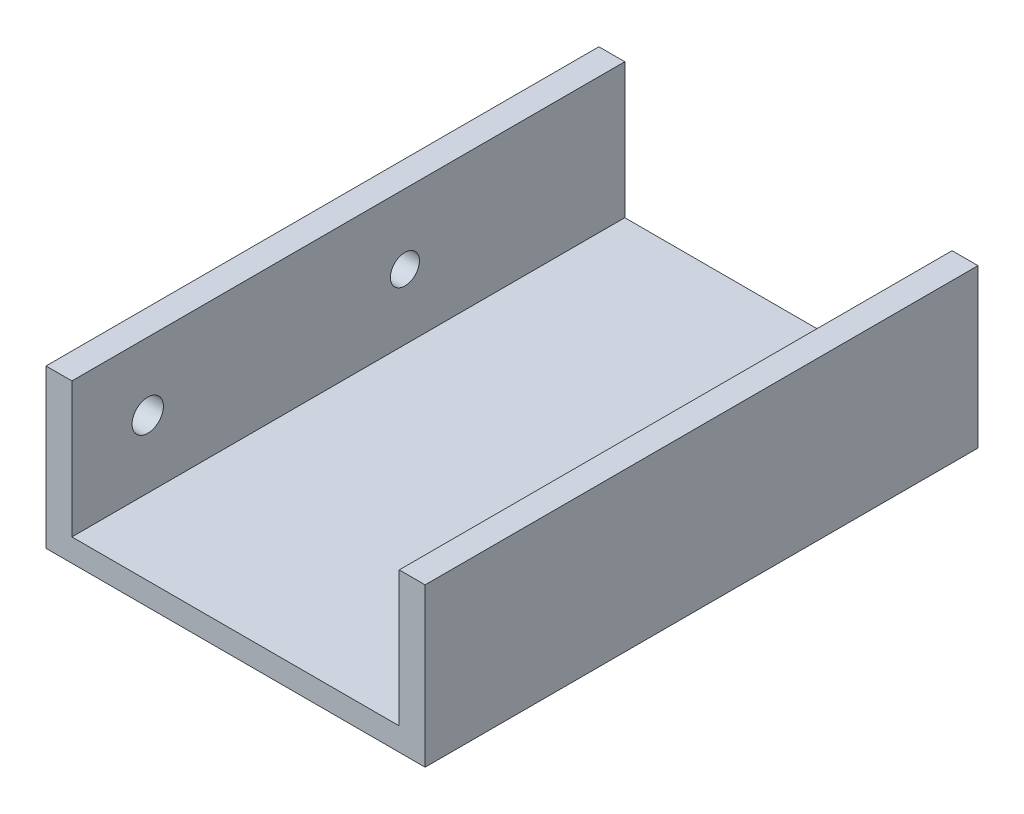
ISO-10303-21;
HEADER;
FILE_DESCRIPTION(('STEP AP214'),'2;1');
FILE_NAME('part.step','',(''),(''),'','','');
FILE_SCHEMA(('AUTOMOTIVE_DESIGN { 1 0 10303 214 1 1 1 1 }'));
ENDSEC;
DATA;
#1=APPLICATION_CONTEXT('core data for automotive mechanical design processes');
#2=APPLICATION_PROTOCOL_DEFINITION('international standard','automotive_design',2000,#1);
#3=PRODUCT_CONTEXT('',#1,'mechanical');
#4=PRODUCT('Part','Part','',(#3));
#5=PRODUCT_RELATED_PRODUCT_CATEGORY('part','',(#4));
#6=PRODUCT_DEFINITION_FORMATION('','',#4);
#7=PRODUCT_DEFINITION_CONTEXT('part definition',#1,'design');
#8=PRODUCT_DEFINITION('design','',#6,#7);
#9=PRODUCT_DEFINITION_SHAPE('','',#8);
#10=(LENGTH_UNIT() NAMED_UNIT(*) SI_UNIT(.MILLI.,.METRE.));
#11=(NAMED_UNIT(*) PLANE_ANGLE_UNIT() SI_UNIT($,.RADIAN.));
#12=(NAMED_UNIT(*) SI_UNIT($,.STERADIAN.) SOLID_ANGLE_UNIT());
#13=UNCERTAINTY_MEASURE_WITH_UNIT(LENGTH_MEASURE(1.E-05),#10,'distance_accuracy_value','');
#14=(GEOMETRIC_REPRESENTATION_CONTEXT(3) GLOBAL_UNCERTAINTY_ASSIGNED_CONTEXT((#13)) GLOBAL_UNIT_ASSIGNED_CONTEXT((#10,
#11,#12)) REPRESENTATION_CONTEXT('',''));
#15=CARTESIAN_POINT('',(0.,0.,0.));
#16=DIRECTION('',(0.,0.,1.));
#17=DIRECTION('',(1.,0.,0.));
#18=AXIS2_PLACEMENT_3D('',#15,#16,#17);
#19=CARTESIAN_POINT('',(-38.1,0.,111.125));
#20=DIRECTION('',(1.,0.,0.));
#21=DIRECTION('',(0.,0.,-1.));
#22=AXIS2_PLACEMENT_3D('',#19,#20,#21);
#23=PLANE('',#22);
#24=CARTESIAN_POINT('',(-38.1,18.1633908346726,95.885));
#25=DIRECTION('',(1.,0.,0.));
#26=DIRECTION('',(0.,0.,-1.));
#27=AXIS2_PLACEMENT_3D('',#24,#25,#26);
#28=CIRCLE('',#27,3.14546367246749);
#29=CARTESIAN_POINT('',(-38.1,18.1633908346726,92.7395363275325));
#30=VERTEX_POINT('',#29);
#31=EDGE_CURVE('E180',#30,#30,#28,.T.);
#32=ORIENTED_EDGE('',*,*,#31,.T.);
#33=EDGE_LOOP('',(#32));
#34=FACE_BOUND('',#33,.T.);
#35=CARTESIAN_POINT('',(-38.1,17.7352117874534,44.196));
#36=DIRECTION('',(1.,0.,0.));
#37=DIRECTION('',(0.,0.,-1.));
#38=AXIS2_PLACEMENT_3D('',#35,#36,#37);
#39=CIRCLE('',#38,2.921);
#40=CARTESIAN_POINT('',(-38.1,17.7352117874534,41.275));
#41=VERTEX_POINT('',#40);
#42=EDGE_CURVE('E133',#41,#41,#39,.T.);
#43=ORIENTED_EDGE('',*,*,#42,.T.);
#44=EDGE_LOOP('',(#43));
#45=FACE_BOUND('',#44,.T.);
#46=DIRECTION('',(0.,-1.,0.));
#47=VECTOR('',#46,1.);
#48=CARTESIAN_POINT('',(-38.1,0.,0.));
#49=LINE('',#48,#47);
#50=CARTESIAN_POINT('',(-38.1,31.75,0.));
#51=VERTEX_POINT('',#50);
#52=CARTESIAN_POINT('',(-38.1,0.,0.));
#53=VERTEX_POINT('',#52);
#54=EDGE_CURVE('E129',#51,#53,#49,.T.);
#55=ORIENTED_EDGE('',*,*,#54,.T.);
#56=DIRECTION('',(0.,0.,-1.));
#57=VECTOR('',#56,1.);
#58=CARTESIAN_POINT('',(-38.1,0.,111.125));
#59=LINE('',#58,#57);
#60=CARTESIAN_POINT('',(-38.1,0.,111.125));
#61=VERTEX_POINT('',#60);
#62=EDGE_CURVE('E11',#61,#53,#59,.T.);
#63=ORIENTED_EDGE('',*,*,#62,.F.);
#64=DIRECTION('',(0.,-1.,0.));
#65=VECTOR('',#64,1.);
#66=CARTESIAN_POINT('',(-38.1,0.,111.125));
#67=LINE('',#66,#65);
#68=CARTESIAN_POINT('',(-38.1,31.75,111.125));
#69=VERTEX_POINT('',#68);
#70=EDGE_CURVE('E144',#69,#61,#67,.T.);
#71=ORIENTED_EDGE('',*,*,#70,.F.);
#72=DIRECTION('',(0.,0.,-1.));
#73=VECTOR('',#72,1.);
#74=CARTESIAN_POINT('',(-38.1,31.75,111.125));
#75=LINE('',#74,#73);
#76=EDGE_CURVE('E125',#69,#51,#75,.T.);
#77=ORIENTED_EDGE('',*,*,#76,.T.);
#78=EDGE_LOOP('',(#55,#63,#71,#77));
#79=FACE_BOUND('',#78,.T.);
#80=ADVANCED_FACE('F33',(#34,#45,#79),#23,.F.);
#81=CARTESIAN_POINT('',(-38.1,0.,111.125));
#82=DIRECTION('',(0.,1.,0.));
#83=DIRECTION('',(-1.,0.,0.));
#84=AXIS2_PLACEMENT_3D('',#81,#82,#83);
#85=PLANE('',#84);
#86=DIRECTION('',(1.,0.,0.));
#87=VECTOR('',#86,1.);
#88=CARTESIAN_POINT('',(-38.1,0.,0.));
#89=LINE('',#88,#87);
#90=CARTESIAN_POINT('',(38.1,0.,0.));
#91=VERTEX_POINT('',#90);
#92=EDGE_CURVE('E132',#53,#91,#89,.T.);
#93=ORIENTED_EDGE('',*,*,#92,.T.);
#94=DIRECTION('',(0.,0.,-1.));
#95=VECTOR('',#94,1.);
#96=CARTESIAN_POINT('',(38.1,0.,111.125));
#97=LINE('',#96,#95);
#98=CARTESIAN_POINT('',(38.1,0.,111.125));
#99=VERTEX_POINT('',#98);
#100=EDGE_CURVE('E41',#99,#91,#97,.T.);
#101=ORIENTED_EDGE('',*,*,#100,.F.);
#102=DIRECTION('',(1.,0.,0.));
#103=VECTOR('',#102,1.);
#104=CARTESIAN_POINT('',(-38.1,0.,111.125));
#105=LINE('',#104,#103);
#106=EDGE_CURVE('E92',#61,#99,#105,.T.);
#107=ORIENTED_EDGE('',*,*,#106,.F.);
#108=ORIENTED_EDGE('',*,*,#62,.T.);
#109=EDGE_LOOP('',(#93,#101,#107,#108));
#110=FACE_BOUND('',#109,.T.);
#111=ADVANCED_FACE('F214',(#110),#85,.F.);
#112=CARTESIAN_POINT('',(38.1,31.75,111.125));
#113=DIRECTION('',(-1.,0.,0.));
#114=DIRECTION('',(0.,-1.,0.));
#115=AXIS2_PLACEMENT_3D('',#112,#113,#114);
#116=PLANE('',#115);
#117=DIRECTION('',(0.,1.,0.));
#118=VECTOR('',#117,1.);
#119=CARTESIAN_POINT('',(38.1,31.75,0.));
#120=LINE('',#119,#118);
#121=CARTESIAN_POINT('',(38.1,31.75,0.));
#122=VERTEX_POINT('',#121);
#123=EDGE_CURVE('E135',#91,#122,#120,.T.);
#124=ORIENTED_EDGE('',*,*,#123,.T.);
#125=DIRECTION('',(0.,0.,-1.));
#126=VECTOR('',#125,1.);
#127=CARTESIAN_POINT('',(38.1,31.75,111.125));
#128=LINE('',#127,#126);
#129=CARTESIAN_POINT('',(38.1,31.75,111.125));
#130=VERTEX_POINT('',#129);
#131=EDGE_CURVE('E151',#130,#122,#128,.T.);
#132=ORIENTED_EDGE('',*,*,#131,.F.);
#133=DIRECTION('',(0.,1.,0.));
#134=VECTOR('',#133,1.);
#135=CARTESIAN_POINT('',(38.1,31.75,111.125));
#136=LINE('',#135,#134);
#137=EDGE_CURVE('E159',#99,#130,#136,.T.);
#138=ORIENTED_EDGE('',*,*,#137,.F.);
#139=ORIENTED_EDGE('',*,*,#100,.T.);
#140=EDGE_LOOP('',(#124,#132,#138,#139));
#141=FACE_BOUND('',#140,.T.);
#142=ADVANCED_FACE('F157',(#141),#116,.F.);
#143=CARTESIAN_POINT('',(32.893,31.75,111.125));
#144=DIRECTION('',(0.,-1.,0.));
#145=DIRECTION('',(0.,0.,-1.));
#146=AXIS2_PLACEMENT_3D('',#143,#144,#145);
#147=PLANE('',#146);
#148=DIRECTION('',(-1.,0.,0.));
#149=VECTOR('',#148,1.);
#150=CARTESIAN_POINT('',(32.893,31.75,0.));
#151=LINE('',#150,#149);
#152=CARTESIAN_POINT('',(32.893,31.75,0.));
#153=VERTEX_POINT('',#152);
#154=EDGE_CURVE('E137',#122,#153,#151,.T.);
#155=ORIENTED_EDGE('',*,*,#154,.T.);
#156=DIRECTION('',(0.,0.,-1.));
#157=VECTOR('',#156,1.);
#158=CARTESIAN_POINT('',(32.893,31.75,111.125));
#159=LINE('',#158,#157);
#160=CARTESIAN_POINT('',(32.893,31.75,111.125));
#161=VERTEX_POINT('',#160);
#162=EDGE_CURVE('E148',#161,#153,#159,.T.);
#163=ORIENTED_EDGE('',*,*,#162,.F.);
#164=DIRECTION('',(-1.,0.,0.));
#165=VECTOR('',#164,1.);
#166=CARTESIAN_POINT('',(32.893,31.75,111.125));
#167=LINE('',#166,#165);
#168=EDGE_CURVE('E171',#130,#161,#167,.T.);
#169=ORIENTED_EDGE('',*,*,#168,.F.);
#170=ORIENTED_EDGE('',*,*,#131,.T.);
#171=EDGE_LOOP('',(#155,#163,#169,#170));
#172=FACE_BOUND('',#171,.T.);
#173=ADVANCED_FACE('F167',(#172),#147,.F.);
#174=CARTESIAN_POINT('',(32.893,4.5974,111.125));
#175=DIRECTION('',(1.,0.,0.));
#176=DIRECTION('',(0.,0.,-1.));
#177=AXIS2_PLACEMENT_3D('',#174,#175,#176);
#178=PLANE('',#177);
#179=DIRECTION('',(0.,-1.,0.));
#180=VECTOR('',#179,1.);
#181=CARTESIAN_POINT('',(32.893,4.5974,0.));
#182=LINE('',#181,#180);
#183=CARTESIAN_POINT('',(32.893,4.5974,0.));
#184=VERTEX_POINT('',#183);
#185=EDGE_CURVE('E139',#153,#184,#182,.T.);
#186=ORIENTED_EDGE('',*,*,#185,.T.);
#187=DIRECTION('',(0.,0.,-1.));
#188=VECTOR('',#187,1.);
#189=CARTESIAN_POINT('',(32.893,4.5974,111.125));
#190=LINE('',#189,#188);
#191=CARTESIAN_POINT('',(32.893,4.5974,111.125));
#192=VERTEX_POINT('',#191);
#193=EDGE_CURVE('E120',#192,#184,#190,.T.);
#194=ORIENTED_EDGE('',*,*,#193,.F.);
#195=DIRECTION('',(0.,-1.,0.));
#196=VECTOR('',#195,1.);
#197=CARTESIAN_POINT('',(32.893,4.5974,111.125));
#198=LINE('',#197,#196);
#199=EDGE_CURVE('E111',#161,#192,#198,.T.);
#200=ORIENTED_EDGE('',*,*,#199,.F.);
#201=ORIENTED_EDGE('',*,*,#162,.T.);
#202=EDGE_LOOP('',(#186,#194,#200,#201));
#203=FACE_BOUND('',#202,.T.);
#204=ADVANCED_FACE('F170',(#203),#178,.F.);
#205=CARTESIAN_POINT('',(-32.893,4.5974,111.125));
#206=DIRECTION('',(0.,-1.,0.));
#207=DIRECTION('',(0.,0.,-1.));
#208=AXIS2_PLACEMENT_3D('',#205,#206,#207);
#209=PLANE('',#208);
#210=DIRECTION('',(-1.,0.,0.));
#211=VECTOR('',#210,1.);
#212=CARTESIAN_POINT('',(-32.893,4.5974,0.));
#213=LINE('',#212,#211);
#214=CARTESIAN_POINT('',(-32.893,4.5974,0.));
#215=VERTEX_POINT('',#214);
#216=EDGE_CURVE('E119',#184,#215,#213,.T.);
#217=ORIENTED_EDGE('',*,*,#216,.T.);
#218=DIRECTION('',(0.,0.,-1.));
#219=VECTOR('',#218,1.);
#220=CARTESIAN_POINT('',(-32.893,4.5974,111.125));
#221=LINE('',#220,#219);
#222=CARTESIAN_POINT('',(-32.893,4.5974,111.125));
#223=VERTEX_POINT('',#222);
#224=EDGE_CURVE('E116',#223,#215,#221,.T.);
#225=ORIENTED_EDGE('',*,*,#224,.F.);
#226=DIRECTION('',(-1.,0.,0.));
#227=VECTOR('',#226,1.);
#228=CARTESIAN_POINT('',(-32.893,4.5974,111.125));
#229=LINE('',#228,#227);
#230=EDGE_CURVE('E105',#192,#223,#229,.T.);
#231=ORIENTED_EDGE('',*,*,#230,.F.);
#232=ORIENTED_EDGE('',*,*,#193,.T.);
#233=EDGE_LOOP('',(#217,#225,#231,#232));
#234=FACE_BOUND('',#233,.T.);
#235=ADVANCED_FACE('F117',(#234),#209,.F.);
#236=CARTESIAN_POINT('',(-32.893,31.75,111.125));
#237=DIRECTION('',(-1.,0.,0.));
#238=DIRECTION('',(0.,0.,1.));
#239=AXIS2_PLACEMENT_3D('',#236,#237,#238);
#240=PLANE('',#239);
#241=CARTESIAN_POINT('',(-32.893,18.1633908346726,95.885));
#242=DIRECTION('',(1.,0.,0.));
#243=DIRECTION('',(0.,0.,-1.));
#244=AXIS2_PLACEMENT_3D('',#241,#242,#243);
#245=CIRCLE('',#244,3.14546367246749);
#246=CARTESIAN_POINT('',(-32.893,18.1633908346726,92.7395363275325));
#247=VERTEX_POINT('',#246);
#248=EDGE_CURVE('E183',#247,#247,#245,.T.);
#249=ORIENTED_EDGE('',*,*,#248,.F.);
#250=EDGE_LOOP('',(#249));
#251=FACE_BOUND('',#250,.T.);
#252=CARTESIAN_POINT('',(-32.893,17.7352117874534,44.196));
#253=DIRECTION('',(1.,0.,0.));
#254=DIRECTION('',(0.,0.,-1.));
#255=AXIS2_PLACEMENT_3D('',#252,#253,#254);
#256=CIRCLE('',#255,2.921);
#257=CARTESIAN_POINT('',(-32.893,17.7352117874534,41.275));
#258=VERTEX_POINT('',#257);
#259=EDGE_CURVE('E177',#258,#258,#256,.T.);
#260=ORIENTED_EDGE('',*,*,#259,.F.);
#261=EDGE_LOOP('',(#260));
#262=FACE_BOUND('',#261,.T.);
#263=DIRECTION('',(0.,1.,0.));
#264=VECTOR('',#263,1.);
#265=CARTESIAN_POINT('',(-32.893,31.75,0.));
#266=LINE('',#265,#264);
#267=CARTESIAN_POINT('',(-32.893,31.75,0.));
#268=VERTEX_POINT('',#267);
#269=EDGE_CURVE('E78',#215,#268,#266,.T.);
#270=ORIENTED_EDGE('',*,*,#269,.T.);
#271=DIRECTION('',(0.,0.,-1.));
#272=VECTOR('',#271,1.);
#273=CARTESIAN_POINT('',(-32.893,31.75,111.125));
#274=LINE('',#273,#272);
#275=CARTESIAN_POINT('',(-32.893,31.75,111.125));
#276=VERTEX_POINT('',#275);
#277=EDGE_CURVE('E121',#276,#268,#274,.T.);
#278=ORIENTED_EDGE('',*,*,#277,.F.);
#279=DIRECTION('',(0.,1.,0.));
#280=VECTOR('',#279,1.);
#281=CARTESIAN_POINT('',(-32.893,31.75,111.125));
#282=LINE('',#281,#280);
#283=EDGE_CURVE('E109',#223,#276,#282,.T.);
#284=ORIENTED_EDGE('',*,*,#283,.F.);
#285=ORIENTED_EDGE('',*,*,#224,.T.);
#286=EDGE_LOOP('',(#270,#278,#284,#285));
#287=FACE_BOUND('',#286,.T.);
#288=ADVANCED_FACE('F123',(#251,#262,#287),#240,.F.);
#289=CARTESIAN_POINT('',(-38.1,31.75,111.125));
#290=DIRECTION('',(0.,-1.,0.));
#291=DIRECTION('',(0.,0.,-1.));
#292=AXIS2_PLACEMENT_3D('',#289,#290,#291);
#293=PLANE('',#292);
#294=DIRECTION('',(-1.,0.,0.));
#295=VECTOR('',#294,1.);
#296=CARTESIAN_POINT('',(-38.1,31.75,0.));
#297=LINE('',#296,#295);
#298=EDGE_CURVE('E84',#268,#51,#297,.T.);
#299=ORIENTED_EDGE('',*,*,#298,.T.);
#300=ORIENTED_EDGE('',*,*,#76,.F.);
#301=DIRECTION('',(-1.,0.,0.));
#302=VECTOR('',#301,1.);
#303=CARTESIAN_POINT('',(-38.1,31.75,111.125));
#304=LINE('',#303,#302);
#305=EDGE_CURVE('E49',#276,#69,#304,.T.);
#306=ORIENTED_EDGE('',*,*,#305,.F.);
#307=ORIENTED_EDGE('',*,*,#277,.T.);
#308=EDGE_LOOP('',(#299,#300,#306,#307));
#309=FACE_BOUND('',#308,.T.);
#310=ADVANCED_FACE('F200',(#309),#293,.F.);
#311=CARTESIAN_POINT('',(0.,0.,111.125));
#312=DIRECTION('',(0.,0.,-1.));
#313=DIRECTION('',(-1.,0.,0.));
#314=AXIS2_PLACEMENT_3D('',#311,#312,#313);
#315=PLANE('',#314);
#316=ORIENTED_EDGE('',*,*,#70,.T.);
#317=ORIENTED_EDGE('',*,*,#106,.T.);
#318=ORIENTED_EDGE('',*,*,#137,.T.);
#319=ORIENTED_EDGE('',*,*,#168,.T.);
#320=ORIENTED_EDGE('',*,*,#199,.T.);
#321=ORIENTED_EDGE('',*,*,#230,.T.);
#322=ORIENTED_EDGE('',*,*,#283,.T.);
#323=ORIENTED_EDGE('',*,*,#305,.T.);
#324=EDGE_LOOP('',(#316,#317,#318,#319,#320,#321,#322,#323));
#325=FACE_BOUND('',#324,.T.);
#326=ADVANCED_FACE('F107',(#325),#315,.F.);
#327=CARTESIAN_POINT('',(0.,0.,0.));
#328=DIRECTION('',(0.,0.,-1.));
#329=DIRECTION('',(-1.,0.,0.));
#330=AXIS2_PLACEMENT_3D('',#327,#328,#329);
#331=PLANE('',#330);
#332=ORIENTED_EDGE('',*,*,#54,.F.);
#333=ORIENTED_EDGE('',*,*,#298,.F.);
#334=ORIENTED_EDGE('',*,*,#269,.F.);
#335=ORIENTED_EDGE('',*,*,#216,.F.);
#336=ORIENTED_EDGE('',*,*,#185,.F.);
#337=ORIENTED_EDGE('',*,*,#154,.F.);
#338=ORIENTED_EDGE('',*,*,#123,.F.);
#339=ORIENTED_EDGE('',*,*,#92,.F.);
#340=EDGE_LOOP('',(#332,#333,#334,#335,#336,#337,#338,#339));
#341=FACE_BOUND('',#340,.T.);
#342=ADVANCED_FACE('F163',(#341),#331,.T.);
#343=CARTESIAN_POINT('',(-38.1,17.7352117874534,44.196));
#344=DIRECTION('',(1.,0.,0.));
#345=DIRECTION('',(0.,0.,-1.));
#346=AXIS2_PLACEMENT_3D('',#343,#344,#345);
#347=CYLINDRICAL_SURFACE('',#346,2.921);
#348=ORIENTED_EDGE('',*,*,#42,.F.);
#349=EDGE_LOOP('',(#348));
#350=FACE_BOUND('',#349,.T.);
#351=ORIENTED_EDGE('',*,*,#259,.T.);
#352=EDGE_LOOP('',(#351));
#353=FACE_BOUND('',#352,.T.);
#354=ADVANCED_FACE('F194',(#350,#353),#347,.F.);
#355=CARTESIAN_POINT('',(-38.1,18.1633908346726,95.885));
#356=DIRECTION('',(1.,0.,0.));
#357=DIRECTION('',(0.,0.,-1.));
#358=AXIS2_PLACEMENT_3D('',#355,#356,#357);
#359=CYLINDRICAL_SURFACE('',#358,3.14546367246749);
#360=ORIENTED_EDGE('',*,*,#31,.F.);
#361=EDGE_LOOP('',(#360));
#362=FACE_BOUND('',#361,.T.);
#363=ORIENTED_EDGE('',*,*,#248,.T.);
#364=EDGE_LOOP('',(#363));
#365=FACE_BOUND('',#364,.T.);
#366=ADVANCED_FACE('F191',(#362,#365),#359,.F.);
#367=CLOSED_SHELL('',(#80,#111,#142,#173,#204,#235,#288,#310,#326,#342,#354,#366));
#368=MANIFOLD_SOLID_BREP('B2',#367);
#369=ADVANCED_BREP_SHAPE_REPRESENTATION('',(#18,#368),#14);
#370=SHAPE_DEFINITION_REPRESENTATION(#9,#369);
ENDSEC;
END-ISO-10303-21;
